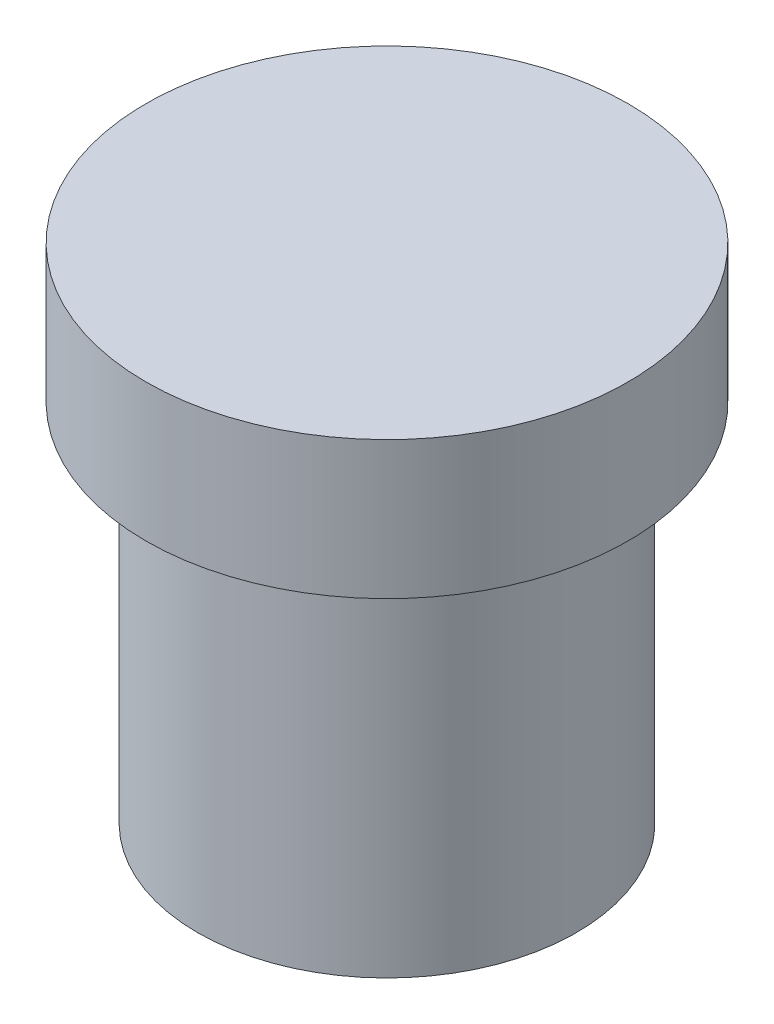
ISO-10303-21;
HEADER;
FILE_DESCRIPTION(('STEP AP214'),'2;1');
FILE_NAME('part.step','',(''),(''),'','','');
FILE_SCHEMA(('AUTOMOTIVE_DESIGN { 1 0 10303 214 1 1 1 1 }'));
ENDSEC;
DATA;
#1=APPLICATION_CONTEXT('core data for automotive mechanical design processes');
#2=APPLICATION_PROTOCOL_DEFINITION('international standard','automotive_design',2000,#1);
#3=PRODUCT_CONTEXT('',#1,'mechanical');
#4=PRODUCT('Part','Part','',(#3));
#5=PRODUCT_RELATED_PRODUCT_CATEGORY('part','',(#4));
#6=PRODUCT_DEFINITION_FORMATION('','',#4);
#7=PRODUCT_DEFINITION_CONTEXT('part definition',#1,'design');
#8=PRODUCT_DEFINITION('design','',#6,#7);
#9=PRODUCT_DEFINITION_SHAPE('','',#8);
#10=(LENGTH_UNIT() NAMED_UNIT(*) SI_UNIT(.MILLI.,.METRE.));
#11=(NAMED_UNIT(*) PLANE_ANGLE_UNIT() SI_UNIT($,.RADIAN.));
#12=(NAMED_UNIT(*) SI_UNIT($,.STERADIAN.) SOLID_ANGLE_UNIT());
#13=UNCERTAINTY_MEASURE_WITH_UNIT(LENGTH_MEASURE(1.E-05),#10,'distance_accuracy_value','');
#14=(GEOMETRIC_REPRESENTATION_CONTEXT(3) GLOBAL_UNCERTAINTY_ASSIGNED_CONTEXT((#13)) GLOBAL_UNIT_ASSIGNED_CONTEXT((#10,
#11,#12)) REPRESENTATION_CONTEXT('',''));
#15=CARTESIAN_POINT('',(0.,0.,0.));
#16=DIRECTION('',(0.,0.,1.));
#17=DIRECTION('',(1.,0.,0.));
#18=AXIS2_PLACEMENT_3D('',#15,#16,#17);
#19=CARTESIAN_POINT('',(0.,10.,0.));
#20=DIRECTION('',(0.,-1.,0.));
#21=DIRECTION('',(0.,0.,-1.));
#22=AXIS2_PLACEMENT_3D('',#19,#20,#21);
#23=CYLINDRICAL_SURFACE('',#22,5.);
#24=CARTESIAN_POINT('',(0.,10.,0.));
#25=DIRECTION('',(0.,1.,0.));
#26=DIRECTION('',(0.,0.,1.));
#27=AXIS2_PLACEMENT_3D('',#24,#25,#26);
#28=CIRCLE('',#27,5.);
#29=CARTESIAN_POINT('',(0.,10.,5.));
#30=VERTEX_POINT('',#29);
#31=EDGE_CURVE('E10',#30,#30,#28,.T.);
#32=ORIENTED_EDGE('',*,*,#31,.F.);
#33=EDGE_LOOP('',(#32));
#34=FACE_BOUND('',#33,.T.);
#35=CARTESIAN_POINT('',(0.,0.,0.));
#36=DIRECTION('',(0.,1.,0.));
#37=DIRECTION('',(0.,0.,1.));
#38=AXIS2_PLACEMENT_3D('',#35,#36,#37);
#39=CIRCLE('',#38,5.);
#40=CARTESIAN_POINT('',(0.,0.,5.));
#41=VERTEX_POINT('',#40);
#42=EDGE_CURVE('E34',#41,#41,#39,.T.);
#43=ORIENTED_EDGE('',*,*,#42,.T.);
#44=EDGE_LOOP('',(#43));
#45=FACE_BOUND('',#44,.T.);
#46=ADVANCED_FACE('F31',(#34,#45),#23,.T.);
#47=CARTESIAN_POINT('',(0.,0.,0.));
#48=DIRECTION('',(0.,1.,0.));
#49=DIRECTION('',(0.,0.,1.));
#50=AXIS2_PLACEMENT_3D('',#47,#48,#49);
#51=PLANE('',#50);
#52=ORIENTED_EDGE('',*,*,#42,.F.);
#53=EDGE_LOOP('',(#52));
#54=FACE_BOUND('',#53,.T.);
#55=ADVANCED_FACE('F73',(#54),#51,.F.);
#56=CARTESIAN_POINT('',(0.,63.,0.));
#57=DIRECTION('',(0.,-1.,0.));
#58=DIRECTION('',(0.,0.,-1.));
#59=AXIS2_PLACEMENT_3D('',#56,#57,#58);
#60=CYLINDRICAL_SURFACE('',#59,27.5);
#61=CARTESIAN_POINT('',(0.,63.,0.));
#62=DIRECTION('',(0.,1.,0.));
#63=DIRECTION('',(0.,0.,1.));
#64=AXIS2_PLACEMENT_3D('',#61,#62,#63);
#65=CIRCLE('',#64,27.5);
#66=CARTESIAN_POINT('',(0.,63.,27.5));
#67=VERTEX_POINT('',#66);
#68=EDGE_CURVE('E41',#67,#67,#65,.T.);
#69=ORIENTED_EDGE('',*,*,#68,.F.);
#70=EDGE_LOOP('',(#69));
#71=FACE_BOUND('',#70,.T.);
#72=CARTESIAN_POINT('',(0.,10.,0.));
#73=DIRECTION('',(0.,1.,0.));
#74=DIRECTION('',(0.,0.,1.));
#75=AXIS2_PLACEMENT_3D('',#72,#73,#74);
#76=CIRCLE('',#75,27.5);
#77=CARTESIAN_POINT('',(0.,10.,27.5));
#78=VERTEX_POINT('',#77);
#79=EDGE_CURVE('E43',#78,#78,#76,.T.);
#80=ORIENTED_EDGE('',*,*,#79,.T.);
#81=EDGE_LOOP('',(#80));
#82=FACE_BOUND('',#81,.T.);
#83=ADVANCED_FACE('F78',(#71,#82),#60,.T.);
#84=CARTESIAN_POINT('',(0.,10.,0.));
#85=DIRECTION('',(0.,1.,0.));
#86=DIRECTION('',(0.,0.,1.));
#87=AXIS2_PLACEMENT_3D('',#84,#85,#86);
#88=PLANE('',#87);
#89=ORIENTED_EDGE('',*,*,#31,.T.);
#90=EDGE_LOOP('',(#89));
#91=FACE_BOUND('',#90,.T.);
#92=ORIENTED_EDGE('',*,*,#79,.F.);
#93=EDGE_LOOP('',(#92));
#94=FACE_BOUND('',#93,.T.);
#95=ADVANCED_FACE('F60',(#91,#94),#88,.F.);
#96=CARTESIAN_POINT('',(0.,83.,0.));
#97=DIRECTION('',(0.,-1.,0.));
#98=DIRECTION('',(0.,0.,-1.));
#99=AXIS2_PLACEMENT_3D('',#96,#97,#98);
#100=CYLINDRICAL_SURFACE('',#99,35.);
#101=CARTESIAN_POINT('',(0.,83.,0.));
#102=DIRECTION('',(0.,1.,0.));
#103=DIRECTION('',(0.,0.,1.));
#104=AXIS2_PLACEMENT_3D('',#101,#102,#103);
#105=CIRCLE('',#104,35.);
#106=CARTESIAN_POINT('',(0.,83.,35.));
#107=VERTEX_POINT('',#106);
#108=EDGE_CURVE('E46',#107,#107,#105,.T.);
#109=ORIENTED_EDGE('',*,*,#108,.F.);
#110=EDGE_LOOP('',(#109));
#111=FACE_BOUND('',#110,.T.);
#112=CARTESIAN_POINT('',(0.,63.,0.));
#113=DIRECTION('',(0.,1.,0.));
#114=DIRECTION('',(0.,0.,1.));
#115=AXIS2_PLACEMENT_3D('',#112,#113,#114);
#116=CIRCLE('',#115,35.);
#117=CARTESIAN_POINT('',(0.,63.,35.));
#118=VERTEX_POINT('',#117);
#119=EDGE_CURVE('E49',#118,#118,#116,.T.);
#120=ORIENTED_EDGE('',*,*,#119,.T.);
#121=EDGE_LOOP('',(#120));
#122=FACE_BOUND('',#121,.T.);
#123=ADVANCED_FACE('F57',(#111,#122),#100,.T.);
#124=CARTESIAN_POINT('',(0.,83.,0.));
#125=DIRECTION('',(0.,1.,0.));
#126=DIRECTION('',(0.,0.,1.));
#127=AXIS2_PLACEMENT_3D('',#124,#125,#126);
#128=PLANE('',#127);
#129=ORIENTED_EDGE('',*,*,#108,.T.);
#130=EDGE_LOOP('',(#129));
#131=FACE_BOUND('',#130,.T.);
#132=ADVANCED_FACE('F55',(#131),#128,.T.);
#133=CARTESIAN_POINT('',(0.,63.,0.));
#134=DIRECTION('',(0.,1.,0.));
#135=DIRECTION('',(0.,0.,1.));
#136=AXIS2_PLACEMENT_3D('',#133,#134,#135);
#137=PLANE('',#136);
#138=ORIENTED_EDGE('',*,*,#68,.T.);
#139=EDGE_LOOP('',(#138));
#140=FACE_BOUND('',#139,.T.);
#141=ORIENTED_EDGE('',*,*,#119,.F.);
#142=EDGE_LOOP('',(#141));
#143=FACE_BOUND('',#142,.T.);
#144=ADVANCED_FACE('F64',(#140,#143),#137,.F.);
#145=CLOSED_SHELL('',(#46,#55,#83,#95,#123,#132,#144));
#146=MANIFOLD_SOLID_BREP('B2',#145);
#147=ADVANCED_BREP_SHAPE_REPRESENTATION('',(#18,#146),#14);
#148=SHAPE_DEFINITION_REPRESENTATION(#9,#147);
ENDSEC;
END-ISO-10303-21;
